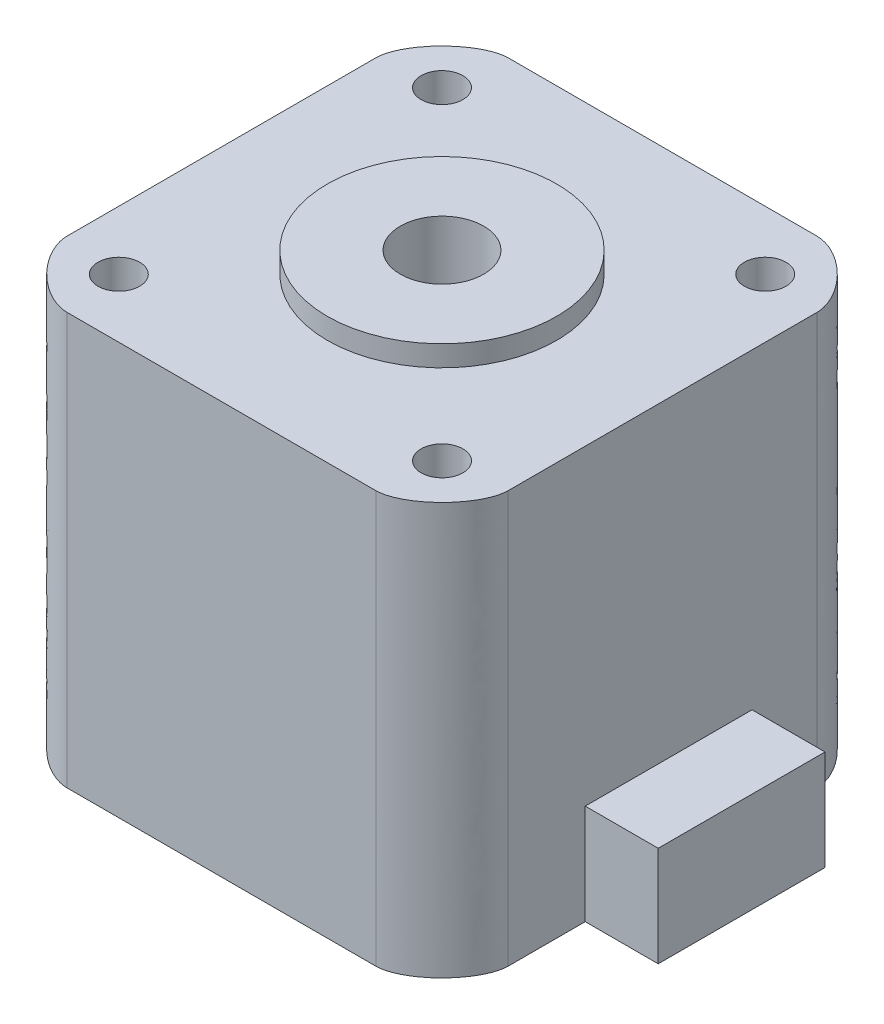
ISO-10303-21;
HEADER;
FILE_DESCRIPTION(('STEP AP214'),'2;1');
FILE_NAME('part.step','',(''),(''),'','','');
FILE_SCHEMA(('AUTOMOTIVE_DESIGN { 1 0 10303 214 1 1 1 1 }'));
ENDSEC;
DATA;
#1=APPLICATION_CONTEXT('core data for automotive mechanical design processes');
#2=APPLICATION_PROTOCOL_DEFINITION('international standard','automotive_design',2000,#1);
#3=PRODUCT_CONTEXT('',#1,'mechanical');
#4=PRODUCT('Part','Part','',(#3));
#5=PRODUCT_RELATED_PRODUCT_CATEGORY('part','',(#4));
#6=PRODUCT_DEFINITION_FORMATION('','',#4);
#7=PRODUCT_DEFINITION_CONTEXT('part definition',#1,'design');
#8=PRODUCT_DEFINITION('design','',#6,#7);
#9=PRODUCT_DEFINITION_SHAPE('','',#8);
#10=(LENGTH_UNIT() NAMED_UNIT(*) SI_UNIT(.MILLI.,.METRE.));
#11=(NAMED_UNIT(*) PLANE_ANGLE_UNIT() SI_UNIT($,.RADIAN.));
#12=(NAMED_UNIT(*) SI_UNIT($,.STERADIAN.) SOLID_ANGLE_UNIT());
#13=UNCERTAINTY_MEASURE_WITH_UNIT(LENGTH_MEASURE(1.E-05),#10,'distance_accuracy_value','');
#14=(GEOMETRIC_REPRESENTATION_CONTEXT(3) GLOBAL_UNCERTAINTY_ASSIGNED_CONTEXT((#13)) GLOBAL_UNIT_ASSIGNED_CONTEXT((#10,
#11,#12)) REPRESENTATION_CONTEXT('',''));
#15=CARTESIAN_POINT('',(0.,0.,0.));
#16=DIRECTION('',(0.,0.,1.));
#17=DIRECTION('',(1.,0.,0.));
#18=AXIS2_PLACEMENT_3D('',#15,#16,#17);
#19=CARTESIAN_POINT('',(27.5590909090909,39.5,-17.4113636363636));
#20=DIRECTION('',(-1.,0.,0.));
#21=DIRECTION('',(0.,0.,1.));
#22=AXIS2_PLACEMENT_3D('',#19,#20,#21);
#23=PLANE('',#22);
#24=DIRECTION('',(0.,-1.,0.));
#25=VECTOR('',#24,1.);
#26=CARTESIAN_POINT('',(27.5590909090909,9.6,11.1510889896497));
#27=LINE('',#26,#25);
#28=CARTESIAN_POINT('',(27.5590909090909,9.6,11.1510889896497));
#29=VERTEX_POINT('',#28);
#30=CARTESIAN_POINT('',(27.5590909090909,0.,11.1510889896497));
#31=VERTEX_POINT('',#30);
#32=EDGE_CURVE('E59',#29,#31,#27,.T.);
#33=ORIENTED_EDGE('',*,*,#32,.F.);
#34=DIRECTION('',(0.,0.,1.));
#35=VECTOR('',#34,1.);
#36=CARTESIAN_POINT('',(27.5590909090909,9.6,11.1510889896497));
#37=LINE('',#36,#35);
#38=CARTESIAN_POINT('',(27.5590909090909,9.6,-4.84891101035028));
#39=VERTEX_POINT('',#38);
#40=EDGE_CURVE('E63',#39,#29,#37,.T.);
#41=ORIENTED_EDGE('',*,*,#40,.F.);
#42=DIRECTION('',(0.,1.,0.));
#43=VECTOR('',#42,1.);
#44=CARTESIAN_POINT('',(27.5590909090909,9.6,-4.84891101035028));
#45=LINE('',#44,#43);
#46=CARTESIAN_POINT('',(27.5590909090909,0.,-4.84891101035028));
#47=VERTEX_POINT('',#46);
#48=EDGE_CURVE('E845',#47,#39,#45,.T.);
#49=ORIENTED_EDGE('',*,*,#48,.F.);
#50=DIRECTION('',(0.,0.,-1.));
#51=VECTOR('',#50,1.);
#52=CARTESIAN_POINT('',(27.5590909090909,0.,-17.4113636363636));
#53=LINE('',#52,#51);
#54=CARTESIAN_POINT('',(27.5590909090909,0.,-11.0613636363636));
#55=VERTEX_POINT('',#54);
#56=EDGE_CURVE('E46',#47,#55,#53,.T.);
#57=ORIENTED_EDGE('',*,*,#56,.T.);
#58=CARTESIAN_POINT('',(27.5590909090909,41.475,-11.0613636363636));
#59=CARTESIAN_POINT('',(27.5590909090909,26.9916666666666,-11.0613636363636));
#60=CARTESIAN_POINT('',(27.5590909090909,12.5083333333334,-11.0613636363636));
#61=CARTESIAN_POINT('',(27.5590909090909,-1.97499999999999,-11.0613636363636));
#62=(BOUNDED_CURVE() B_SPLINE_CURVE(3,(#58,#59,#60,#61),.UNSPECIFIED.,.F.,
.F.) B_SPLINE_CURVE_WITH_KNOTS((4,4),(-0.001975,0.041475),
.UNSPECIFIED.) CURVE() GEOMETRIC_REPRESENTATION_ITEM() RATIONAL_B_SPLINE_CURVE((1.,1.,1.,1.)) REPRESENTATION_ITEM(''));
#63=CARTESIAN_POINT('',(27.5590909090909,39.5,-11.0613636363636));
#64=VERTEX_POINT('',#63);
#65=EDGE_CURVE('E12',#55,#64,#62,.F.);
#66=ORIENTED_EDGE('',*,*,#65,.T.);
#67=DIRECTION('',(0.,0.,-1.));
#68=VECTOR('',#67,1.);
#69=CARTESIAN_POINT('',(27.5590909090909,39.5,-17.4113636363636));
#70=LINE('',#69,#68);
#71=CARTESIAN_POINT('',(27.5590909090909,39.5,18.5386363636363));
#72=VERTEX_POINT('',#71);
#73=EDGE_CURVE('E328',#72,#64,#70,.T.);
#74=ORIENTED_EDGE('',*,*,#73,.F.);
#75=CARTESIAN_POINT('',(27.5590909090909,-1.97499999999999,18.5386363636364));
#76=CARTESIAN_POINT('',(27.5590909090909,12.5083333333334,18.5386363636364));
#77=CARTESIAN_POINT('',(27.5590909090909,26.9916666666666,18.5386363636364));
#78=CARTESIAN_POINT('',(27.5590909090909,41.475,18.5386363636364));
#79=(BOUNDED_CURVE() B_SPLINE_CURVE(3,(#75,#76,#77,#78),.UNSPECIFIED.,.F.,
.F.) B_SPLINE_CURVE_WITH_KNOTS((4,4),(-0.001975,0.041475),
.UNSPECIFIED.) CURVE() GEOMETRIC_REPRESENTATION_ITEM() RATIONAL_B_SPLINE_CURVE((1.,1.,1.,1.)) REPRESENTATION_ITEM(''));
#80=CARTESIAN_POINT('',(27.5590909090909,0.,18.5386363636363));
#81=VERTEX_POINT('',#80);
#82=EDGE_CURVE('E52',#72,#81,#79,.F.);
#83=ORIENTED_EDGE('',*,*,#82,.T.);
#84=EDGE_CURVE('E264',#81,#31,#53,.T.);
#85=ORIENTED_EDGE('',*,*,#84,.T.);
#86=EDGE_LOOP('',(#33,#41,#49,#57,#66,#74,#83,#85));
#87=FACE_BOUND('',#86,.T.);
#88=ADVANCED_FACE('F38',(#87),#23,.F.);
#89=CARTESIAN_POINT('',(-14.7409090909091,39.5,-17.4113636363636));
#90=DIRECTION('',(1.,0.,0.));
#91=DIRECTION('',(0.,0.,-1.));
#92=AXIS2_PLACEMENT_3D('',#89,#90,#91);
#93=PLANE('',#92);
#94=DIRECTION('',(0.,0.,1.));
#95=VECTOR('',#94,1.);
#96=CARTESIAN_POINT('',(-14.7409090909091,39.5,-17.4113636363636));
#97=LINE('',#96,#95);
#98=CARTESIAN_POINT('',(-14.7409090909091,39.5,-11.0613636363636));
#99=VERTEX_POINT('',#98);
#100=CARTESIAN_POINT('',(-14.7409090909091,39.5,18.5386363636364));
#101=VERTEX_POINT('',#100);
#102=EDGE_CURVE('E215',#99,#101,#97,.T.);
#103=ORIENTED_EDGE('',*,*,#102,.F.);
#104=CARTESIAN_POINT('',(-14.7409090909091,-1.97499999999999,-11.0613636363636));
#105=CARTESIAN_POINT('',(-14.7409090909091,12.5083333333334,-11.0613636363636));
#106=CARTESIAN_POINT('',(-14.7409090909091,26.9916666666666,-11.0613636363636));
#107=CARTESIAN_POINT('',(-14.7409090909091,41.475,-11.0613636363636));
#108=(BOUNDED_CURVE() B_SPLINE_CURVE(3,(#104,#105,#106,#107),.UNSPECIFIED.,.F.,
.F.) B_SPLINE_CURVE_WITH_KNOTS((4,4),(-0.001975,0.041475),
.UNSPECIFIED.) CURVE() GEOMETRIC_REPRESENTATION_ITEM() RATIONAL_B_SPLINE_CURVE((1.,1.,1.,1.)) REPRESENTATION_ITEM(''));
#109=CARTESIAN_POINT('',(-14.7409090909091,0.,-11.0613636363636));
#110=VERTEX_POINT('',#109);
#111=EDGE_CURVE('E447',#99,#110,#108,.F.);
#112=ORIENTED_EDGE('',*,*,#111,.T.);
#113=DIRECTION('',(0.,0.,1.));
#114=VECTOR('',#113,1.);
#115=CARTESIAN_POINT('',(-14.7409090909091,0.,-17.4113636363636));
#116=LINE('',#115,#114);
#117=CARTESIAN_POINT('',(-14.7409090909091,0.,18.5386363636364));
#118=VERTEX_POINT('',#117);
#119=EDGE_CURVE('E204',#110,#118,#116,.T.);
#120=ORIENTED_EDGE('',*,*,#119,.T.);
#121=CARTESIAN_POINT('',(-14.7409090909091,41.475,18.5386363636364));
#122=CARTESIAN_POINT('',(-14.7409090909091,26.9916666666666,18.5386363636364));
#123=CARTESIAN_POINT('',(-14.7409090909091,12.5083333333334,18.5386363636364));
#124=CARTESIAN_POINT('',(-14.7409090909091,-1.97499999999999,18.5386363636364));
#125=(BOUNDED_CURVE() B_SPLINE_CURVE(3,(#121,#122,#123,#124),.UNSPECIFIED.,.F.,
.F.) B_SPLINE_CURVE_WITH_KNOTS((4,4),(-0.001975,0.041475),
.UNSPECIFIED.) CURVE() GEOMETRIC_REPRESENTATION_ITEM() RATIONAL_B_SPLINE_CURVE((1.,1.,1.,1.)) REPRESENTATION_ITEM(''));
#126=EDGE_CURVE('E208',#118,#101,#125,.F.);
#127=ORIENTED_EDGE('',*,*,#126,.T.);
#128=EDGE_LOOP('',(#103,#112,#120,#127));
#129=FACE_BOUND('',#128,.T.);
#130=ADVANCED_FACE('F234',(#129),#93,.F.);
#131=CARTESIAN_POINT('',(-14.7409090909091,39.5,24.8886363636364));
#132=DIRECTION('',(0.,0.,-1.));
#133=DIRECTION('',(-1.,0.,0.));
#134=AXIS2_PLACEMENT_3D('',#131,#132,#133);
#135=PLANE('',#134);
#136=DIRECTION('',(1.,0.,0.));
#137=VECTOR('',#136,1.);
#138=CARTESIAN_POINT('',(-14.7409090909091,39.5,24.8886363636364));
#139=LINE('',#138,#137);
#140=CARTESIAN_POINT('',(-8.39090909090907,39.5,24.8886363636364));
#141=VERTEX_POINT('',#140);
#142=CARTESIAN_POINT('',(21.2090909090909,39.5,24.8886363636364));
#143=VERTEX_POINT('',#142);
#144=EDGE_CURVE('E219',#141,#143,#139,.T.);
#145=ORIENTED_EDGE('',*,*,#144,.F.);
#146=CARTESIAN_POINT('',(-8.39090909090906,-1.97499999999999,24.8886363636364));
#147=CARTESIAN_POINT('',(-8.39090909090906,12.5083333333334,24.8886363636364));
#148=CARTESIAN_POINT('',(-8.39090909090906,26.9916666666666,24.8886363636364));
#149=CARTESIAN_POINT('',(-8.39090909090906,41.475,24.8886363636364));
#150=(BOUNDED_CURVE() B_SPLINE_CURVE(3,(#146,#147,#148,#149),.UNSPECIFIED.,.F.,
.F.) B_SPLINE_CURVE_WITH_KNOTS((4,4),(-0.001975,0.041475),
.UNSPECIFIED.) CURVE() GEOMETRIC_REPRESENTATION_ITEM() RATIONAL_B_SPLINE_CURVE((1.,1.,1.,1.)) REPRESENTATION_ITEM(''));
#151=CARTESIAN_POINT('',(-8.39090909090907,0.,24.8886363636364));
#152=VERTEX_POINT('',#151);
#153=EDGE_CURVE('E402',#141,#152,#150,.F.);
#154=ORIENTED_EDGE('',*,*,#153,.T.);
#155=DIRECTION('',(1.,0.,0.));
#156=VECTOR('',#155,1.);
#157=CARTESIAN_POINT('',(-14.7409090909091,0.,24.8886363636364));
#158=LINE('',#157,#156);
#159=CARTESIAN_POINT('',(21.2090909090909,0.,24.8886363636364));
#160=VERTEX_POINT('',#159);
#161=EDGE_CURVE('E273',#152,#160,#158,.T.);
#162=ORIENTED_EDGE('',*,*,#161,.T.);
#163=CARTESIAN_POINT('',(21.2090909090909,41.475,24.8886363636364));
#164=CARTESIAN_POINT('',(21.2090909090909,26.9916666666666,24.8886363636364));
#165=CARTESIAN_POINT('',(21.2090909090909,12.5083333333334,24.8886363636364));
#166=CARTESIAN_POINT('',(21.2090909090909,-1.97499999999999,24.8886363636364));
#167=(BOUNDED_CURVE() B_SPLINE_CURVE(3,(#163,#164,#165,#166),.UNSPECIFIED.,.F.,
.F.) B_SPLINE_CURVE_WITH_KNOTS((4,4),(-0.001975,0.041475),
.UNSPECIFIED.) CURVE() GEOMETRIC_REPRESENTATION_ITEM() RATIONAL_B_SPLINE_CURVE((1.,1.,1.,1.)) REPRESENTATION_ITEM(''));
#168=EDGE_CURVE('E390',#160,#143,#167,.F.);
#169=ORIENTED_EDGE('',*,*,#168,.T.);
#170=EDGE_LOOP('',(#145,#154,#162,#169));
#171=FACE_BOUND('',#170,.T.);
#172=ADVANCED_FACE('F244',(#171),#135,.F.);
#173=CARTESIAN_POINT('',(-14.7409090909091,39.5,-17.4113636363636));
#174=DIRECTION('',(0.,0.,1.));
#175=DIRECTION('',(1.,0.,0.));
#176=AXIS2_PLACEMENT_3D('',#173,#174,#175);
#177=PLANE('',#176);
#178=DIRECTION('',(-1.,0.,0.));
#179=VECTOR('',#178,1.);
#180=CARTESIAN_POINT('',(-14.7409090909091,0.,-17.4113636363636));
#181=LINE('',#180,#179);
#182=CARTESIAN_POINT('',(21.2090909090909,0.,-17.4113636363636));
#183=VERTEX_POINT('',#182);
#184=CARTESIAN_POINT('',(-8.39090909090907,0.,-17.4113636363636));
#185=VERTEX_POINT('',#184);
#186=EDGE_CURVE('E220',#183,#185,#181,.T.);
#187=ORIENTED_EDGE('',*,*,#186,.T.);
#188=CARTESIAN_POINT('',(-8.39090909090907,41.475,-17.4113636363636));
#189=CARTESIAN_POINT('',(-8.39090909090907,26.9916666666666,-17.4113636363636));
#190=CARTESIAN_POINT('',(-8.39090909090907,12.5083333333334,-17.4113636363636));
#191=CARTESIAN_POINT('',(-8.39090909090907,-1.97499999999999,-17.4113636363636));
#192=(BOUNDED_CURVE() B_SPLINE_CURVE(3,(#188,#189,#190,#191),.UNSPECIFIED.,.F.,
.F.) B_SPLINE_CURVE_WITH_KNOTS((4,4),(-0.001975,0.041475),
.UNSPECIFIED.) CURVE() GEOMETRIC_REPRESENTATION_ITEM() RATIONAL_B_SPLINE_CURVE((1.,1.,1.,1.)) REPRESENTATION_ITEM(''));
#193=CARTESIAN_POINT('',(-8.39090909090907,39.5,-17.4113636363636));
#194=VERTEX_POINT('',#193);
#195=EDGE_CURVE('E466',#185,#194,#192,.F.);
#196=ORIENTED_EDGE('',*,*,#195,.T.);
#197=DIRECTION('',(-1.,0.,0.));
#198=VECTOR('',#197,1.);
#199=CARTESIAN_POINT('',(-14.7409090909091,39.5,-17.4113636363636));
#200=LINE('',#199,#198);
#201=CARTESIAN_POINT('',(21.2090909090909,39.5,-17.4113636363636));
#202=VERTEX_POINT('',#201);
#203=EDGE_CURVE('E209',#202,#194,#200,.T.);
#204=ORIENTED_EDGE('',*,*,#203,.F.);
#205=CARTESIAN_POINT('',(21.2090909090909,-1.97499999999999,-17.4113636363636));
#206=CARTESIAN_POINT('',(21.2090909090909,12.5083333333334,-17.4113636363636));
#207=CARTESIAN_POINT('',(21.2090909090909,26.9916666666666,-17.4113636363636));
#208=CARTESIAN_POINT('',(21.2090909090909,41.475,-17.4113636363636));
#209=(BOUNDED_CURVE() B_SPLINE_CURVE(3,(#205,#206,#207,#208),.UNSPECIFIED.,.F.,
.F.) B_SPLINE_CURVE_WITH_KNOTS((4,4),(-0.001975,0.041475),
.UNSPECIFIED.) CURVE() GEOMETRIC_REPRESENTATION_ITEM() RATIONAL_B_SPLINE_CURVE((1.,1.,1.,1.)) REPRESENTATION_ITEM(''));
#210=EDGE_CURVE('E543',#202,#183,#209,.F.);
#211=ORIENTED_EDGE('',*,*,#210,.T.);
#212=EDGE_LOOP('',(#187,#196,#204,#211));
#213=FACE_BOUND('',#212,.T.);
#214=ADVANCED_FACE('F298',(#213),#177,.F.);
#215=CARTESIAN_POINT('',(0.,39.5,0.));
#216=DIRECTION('',(0.,1.,0.));
#217=DIRECTION('',(0.,0.,1.));
#218=AXIS2_PLACEMENT_3D('',#215,#216,#217);
#219=PLANE('',#218);
#220=CARTESIAN_POINT('',(-9.09211100619109,39.5,-11.761363589784));
#221=DIRECTION('',(0.,1.,0.));
#222=DIRECTION('',(0.,0.,1.));
#223=AXIS2_PLACEMENT_3D('',#220,#221,#222);
#224=CIRCLE('',#223,2.);
#225=CARTESIAN_POINT('',(-9.09211100619109,39.5,-9.76136358978397));
#226=VERTEX_POINT('',#225);
#227=EDGE_CURVE('E176',#226,#226,#224,.T.);
#228=ORIENTED_EDGE('',*,*,#227,.F.);
#229=EDGE_LOOP('',(#228));
#230=FACE_BOUND('',#229,.T.);
#231=CARTESIAN_POINT('',(21.9078889938089,39.5,-11.761363589784));
#232=DIRECTION('',(0.,1.,0.));
#233=DIRECTION('',(0.,0.,1.));
#234=AXIS2_PLACEMENT_3D('',#231,#232,#233);
#235=CIRCLE('',#234,2.);
#236=CARTESIAN_POINT('',(21.9078889938089,39.5,-9.76136358978397));
#237=VERTEX_POINT('',#236);
#238=EDGE_CURVE('E183',#237,#237,#235,.T.);
#239=ORIENTED_EDGE('',*,*,#238,.F.);
#240=EDGE_LOOP('',(#239));
#241=FACE_BOUND('',#240,.T.);
#242=CARTESIAN_POINT('',(21.9102928243682,39.5,19.238636317016));
#243=DIRECTION('',(0.,1.,0.));
#244=DIRECTION('',(0.,0.,1.));
#245=AXIS2_PLACEMENT_3D('',#242,#243,#244);
#246=CIRCLE('',#245,2.);
#247=CARTESIAN_POINT('',(21.9102928243682,39.5,21.238636317016));
#248=VERTEX_POINT('',#247);
#249=EDGE_CURVE('E189',#248,#248,#246,.T.);
#250=ORIENTED_EDGE('',*,*,#249,.F.);
#251=EDGE_LOOP('',(#250));
#252=FACE_BOUND('',#251,.T.);
#253=CARTESIAN_POINT('',(-9.08970717563177,39.5,19.238636410216));
#254=DIRECTION('',(0.,1.,0.));
#255=DIRECTION('',(0.,0.,1.));
#256=AXIS2_PLACEMENT_3D('',#253,#254,#255);
#257=CIRCLE('',#256,2.);
#258=CARTESIAN_POINT('',(-9.08970717563177,39.5,21.238636410216));
#259=VERTEX_POINT('',#258);
#260=EDGE_CURVE('E195',#259,#259,#257,.T.);
#261=ORIENTED_EDGE('',*,*,#260,.F.);
#262=EDGE_LOOP('',(#261));
#263=FACE_BOUND('',#262,.T.);
#264=CARTESIAN_POINT('',(6.40909090909093,39.5,3.73863636363637));
#265=DIRECTION('',(0.,1.,0.));
#266=DIRECTION('',(0.,0.,1.));
#267=AXIS2_PLACEMENT_3D('',#264,#265,#266);
#268=CIRCLE('',#267,11.);
#269=CARTESIAN_POINT('',(6.40909090909093,39.5,14.7386363636364));
#270=VERTEX_POINT('',#269);
#271=EDGE_CURVE('E205',#270,#270,#268,.T.);
#272=ORIENTED_EDGE('',*,*,#271,.F.);
#273=EDGE_LOOP('',(#272));
#274=FACE_BOUND('',#273,.T.);
#275=ORIENTED_EDGE('',*,*,#203,.T.);
#276=CARTESIAN_POINT('',(-14.7409090909091,39.5,-11.0613636363636));
#277=CARTESIAN_POINT('',(-14.7409090909091,39.5,-17.4113636363636));
#278=CARTESIAN_POINT('',(-8.39090909090907,39.5,-17.4113636363636));
#279=(BOUNDED_CURVE() B_SPLINE_CURVE(2,(#276,#277,#278),.UNSPECIFIED.,.F.,
.F.) B_SPLINE_CURVE_WITH_KNOTS((3,3),(0.,1.),
.UNSPECIFIED.) CURVE() GEOMETRIC_REPRESENTATION_ITEM() RATIONAL_B_SPLINE_CURVE((1.,
0.449012806053458,1.)) REPRESENTATION_ITEM(''));
#280=EDGE_CURVE('E378',#194,#99,#279,.F.);
#281=ORIENTED_EDGE('',*,*,#280,.T.);
#282=ORIENTED_EDGE('',*,*,#102,.T.);
#283=CARTESIAN_POINT('',(-8.39090909090906,39.5,24.8886363636364));
#284=CARTESIAN_POINT('',(-14.7409090909091,39.5,24.8886363636364));
#285=CARTESIAN_POINT('',(-14.7409090909091,39.5,18.5386363636364));
#286=(BOUNDED_CURVE() B_SPLINE_CURVE(2,(#283,#284,#285),.UNSPECIFIED.,.F.,
.F.) B_SPLINE_CURVE_WITH_KNOTS((3,3),(0.,1.),
.UNSPECIFIED.) CURVE() GEOMETRIC_REPRESENTATION_ITEM() RATIONAL_B_SPLINE_CURVE((1.,
0.449012806053458,1.)) REPRESENTATION_ITEM(''));
#287=EDGE_CURVE('E366',#101,#141,#286,.F.);
#288=ORIENTED_EDGE('',*,*,#287,.T.);
#289=ORIENTED_EDGE('',*,*,#144,.T.);
#290=CARTESIAN_POINT('',(27.5590909090909,39.5,18.5386363636364));
#291=CARTESIAN_POINT('',(27.5590909090909,39.5,24.8886363636364));
#292=CARTESIAN_POINT('',(21.2090909090909,39.5,24.8886363636364));
#293=(BOUNDED_CURVE() B_SPLINE_CURVE(2,(#290,#291,#292),.UNSPECIFIED.,.F.,
.F.) B_SPLINE_CURVE_WITH_KNOTS((3,3),(0.,1.),
.UNSPECIFIED.) CURVE() GEOMETRIC_REPRESENTATION_ITEM() RATIONAL_B_SPLINE_CURVE((1.,
0.449012806053458,1.)) REPRESENTATION_ITEM(''));
#294=EDGE_CURVE('E342',#143,#72,#293,.F.);
#295=ORIENTED_EDGE('',*,*,#294,.T.);
#296=ORIENTED_EDGE('',*,*,#73,.T.);
#297=CARTESIAN_POINT('',(21.2090909090909,39.5,-17.4113636363636));
#298=CARTESIAN_POINT('',(27.5590909090909,39.5,-17.4113636363636));
#299=CARTESIAN_POINT('',(27.5590909090909,39.5,-11.0613636363636));
#300=(BOUNDED_CURVE() B_SPLINE_CURVE(2,(#297,#298,#299),.UNSPECIFIED.,.F.,
.F.) B_SPLINE_CURVE_WITH_KNOTS((3,3),(0.,1.),
.UNSPECIFIED.) CURVE() GEOMETRIC_REPRESENTATION_ITEM() RATIONAL_B_SPLINE_CURVE((1.,
0.449012806053458,1.)) REPRESENTATION_ITEM(''));
#301=EDGE_CURVE('E354',#64,#202,#300,.F.);
#302=ORIENTED_EDGE('',*,*,#301,.T.);
#303=EDGE_LOOP('',(#275,#281,#282,#288,#289,#295,#296,#302));
#304=FACE_BOUND('',#303,.T.);
#305=ADVANCED_FACE('F295',(#230,#241,#252,#263,#274,#304),#219,.T.);
#306=CARTESIAN_POINT('',(0.,0.,0.));
#307=DIRECTION('',(0.,1.,0.));
#308=DIRECTION('',(0.,0.,1.));
#309=AXIS2_PLACEMENT_3D('',#306,#307,#308);
#310=PLANE('',#309);
#311=ORIENTED_EDGE('',*,*,#119,.F.);
#312=CARTESIAN_POINT('',(-8.39090909090907,0.,-17.4113636363636));
#313=CARTESIAN_POINT('',(-14.7409090909091,0.,-17.4113636363636));
#314=CARTESIAN_POINT('',(-14.7409090909091,0.,-11.0613636363636));
#315=(BOUNDED_CURVE() B_SPLINE_CURVE(2,(#312,#313,#314),.UNSPECIFIED.,.F.,
.F.) B_SPLINE_CURVE_WITH_KNOTS((3,3),(0.,1.),
.UNSPECIFIED.) CURVE() GEOMETRIC_REPRESENTATION_ITEM() RATIONAL_B_SPLINE_CURVE((1.,
0.449012806053458,1.)) REPRESENTATION_ITEM(''));
#316=EDGE_CURVE('E317',#110,#185,#315,.F.);
#317=ORIENTED_EDGE('',*,*,#316,.T.);
#318=ORIENTED_EDGE('',*,*,#186,.F.);
#319=CARTESIAN_POINT('',(27.5590909090909,0.,-11.0613636363636));
#320=CARTESIAN_POINT('',(27.5590909090909,0.,-17.4113636363636));
#321=CARTESIAN_POINT('',(21.2090909090909,0.,-17.4113636363636));
#322=(BOUNDED_CURVE() B_SPLINE_CURVE(2,(#319,#320,#321),.UNSPECIFIED.,.F.,
.F.) B_SPLINE_CURVE_WITH_KNOTS((3,3),(0.,1.),
.UNSPECIFIED.) CURVE() GEOMETRIC_REPRESENTATION_ITEM() RATIONAL_B_SPLINE_CURVE((1.,
0.449012806053458,1.)) REPRESENTATION_ITEM(''));
#323=EDGE_CURVE('E533',#183,#55,#322,.F.);
#324=ORIENTED_EDGE('',*,*,#323,.T.);
#325=ORIENTED_EDGE('',*,*,#56,.F.);
#326=DIRECTION('',(-1.,0.,0.));
#327=VECTOR('',#326,1.);
#328=CARTESIAN_POINT('',(34.5590909090909,0.,-4.84891101035028));
#329=LINE('',#328,#327);
#330=CARTESIAN_POINT('',(34.5590909090909,0.,-4.84891101035028));
#331=VERTEX_POINT('',#330);
#332=EDGE_CURVE('E151',#331,#47,#329,.T.);
#333=ORIENTED_EDGE('',*,*,#332,.F.);
#334=DIRECTION('',(0.,0.,-1.));
#335=VECTOR('',#334,1.);
#336=CARTESIAN_POINT('',(34.5590909090909,0.,11.1510889896497));
#337=LINE('',#336,#335);
#338=CARTESIAN_POINT('',(34.5590909090909,0.,11.1510889896497));
#339=VERTEX_POINT('',#338);
#340=EDGE_CURVE('E143',#339,#331,#337,.T.);
#341=ORIENTED_EDGE('',*,*,#340,.F.);
#342=DIRECTION('',(-1.,0.,0.));
#343=VECTOR('',#342,1.);
#344=CARTESIAN_POINT('',(34.5590909090909,0.,11.1510889896497));
#345=LINE('',#344,#343);
#346=EDGE_CURVE('E149',#339,#31,#345,.T.);
#347=ORIENTED_EDGE('',*,*,#346,.T.);
#348=ORIENTED_EDGE('',*,*,#84,.F.);
#349=CARTESIAN_POINT('',(21.2090909090909,0.,24.8886363636364));
#350=CARTESIAN_POINT('',(27.5590909090909,0.,24.8886363636364));
#351=CARTESIAN_POINT('',(27.5590909090909,0.,18.5386363636364));
#352=(BOUNDED_CURVE() B_SPLINE_CURVE(2,(#349,#350,#351),.UNSPECIFIED.,.F.,
.F.) B_SPLINE_CURVE_WITH_KNOTS((3,3),(0.,1.),
.UNSPECIFIED.) CURVE() GEOMETRIC_REPRESENTATION_ITEM() RATIONAL_B_SPLINE_CURVE((1.,
0.449012806053458,1.)) REPRESENTATION_ITEM(''));
#353=EDGE_CURVE('E278',#81,#160,#352,.F.);
#354=ORIENTED_EDGE('',*,*,#353,.T.);
#355=ORIENTED_EDGE('',*,*,#161,.F.);
#356=CARTESIAN_POINT('',(-14.7409090909091,0.,18.5386363636364));
#357=CARTESIAN_POINT('',(-14.7409090909091,0.,24.8886363636364));
#358=CARTESIAN_POINT('',(-8.39090909090906,0.,24.8886363636364));
#359=(BOUNDED_CURVE() B_SPLINE_CURVE(2,(#356,#357,#358),.UNSPECIFIED.,.F.,
.F.) B_SPLINE_CURVE_WITH_KNOTS((3,3),(0.,1.),
.UNSPECIFIED.) CURVE() GEOMETRIC_REPRESENTATION_ITEM() RATIONAL_B_SPLINE_CURVE((1.,
0.449012806053458,1.)) REPRESENTATION_ITEM(''));
#360=EDGE_CURVE('E477',#152,#118,#359,.F.);
#361=ORIENTED_EDGE('',*,*,#360,.T.);
#362=EDGE_LOOP('',(#311,#317,#318,#324,#325,#333,#341,#347,#348,#354,#355,#361));
#363=FACE_BOUND('',#362,.T.);
#364=ADVANCED_FACE('F146',(#363),#310,.F.);
#365=CARTESIAN_POINT('',(6.40909090909093,41.5,3.73863636363637));
#366=DIRECTION('',(0.,-1.,0.));
#367=DIRECTION('',(0.,0.,-1.));
#368=AXIS2_PLACEMENT_3D('',#365,#366,#367);
#369=CYLINDRICAL_SURFACE('',#368,11.);
#370=CARTESIAN_POINT('',(6.40909090909093,41.5,3.73863636363637));
#371=DIRECTION('',(0.,1.,0.));
#372=DIRECTION('',(0.,0.,1.));
#373=AXIS2_PLACEMENT_3D('',#370,#371,#372);
#374=CIRCLE('',#373,11.);
#375=CARTESIAN_POINT('',(6.40909090909093,41.5,14.7386363636364));
#376=VERTEX_POINT('',#375);
#377=EDGE_CURVE('E201',#376,#376,#374,.T.);
#378=ORIENTED_EDGE('',*,*,#377,.F.);
#379=EDGE_LOOP('',(#378));
#380=FACE_BOUND('',#379,.T.);
#381=ORIENTED_EDGE('',*,*,#271,.T.);
#382=EDGE_LOOP('',(#381));
#383=FACE_BOUND('',#382,.T.);
#384=ADVANCED_FACE('F294',(#380,#383),#369,.T.);
#385=CARTESIAN_POINT('',(6.40909090909093,41.5,3.73863636363637));
#386=DIRECTION('',(0.,1.,0.));
#387=DIRECTION('',(0.,0.,1.));
#388=AXIS2_PLACEMENT_3D('',#385,#386,#387);
#389=PLANE('',#388);
#390=CARTESIAN_POINT('',(6.40909090909093,41.5,3.73863636363637));
#391=DIRECTION('',(0.,1.,0.));
#392=DIRECTION('',(0.,0.,1.));
#393=AXIS2_PLACEMENT_3D('',#390,#391,#392);
#394=CIRCLE('',#393,4.);
#395=CARTESIAN_POINT('',(6.40909090909093,41.5,7.73863636363638));
#396=VERTEX_POINT('',#395);
#397=EDGE_CURVE('E166',#396,#396,#394,.T.);
#398=ORIENTED_EDGE('',*,*,#397,.F.);
#399=EDGE_LOOP('',(#398));
#400=FACE_BOUND('',#399,.T.);
#401=ORIENTED_EDGE('',*,*,#377,.T.);
#402=EDGE_LOOP('',(#401));
#403=FACE_BOUND('',#402,.T.);
#404=ADVANCED_FACE('F623',(#400,#403),#389,.T.);
#405=CARTESIAN_POINT('',(-14.7409090909091,41.475,-11.0613636363636));
#406=CARTESIAN_POINT('',(-14.7409090909091,26.9916666666666,-11.0613636363636));
#407=CARTESIAN_POINT('',(-14.7409090909091,12.5083333333334,-11.0613636363636));
#408=CARTESIAN_POINT('',(-14.7409090909091,-1.97499999999999,-11.0613636363636));
#409=CARTESIAN_POINT('',(-14.7409090909091,41.475,-17.4113636363636));
#410=CARTESIAN_POINT('',(-14.7409090909091,26.9916666666666,-17.4113636363636));
#411=CARTESIAN_POINT('',(-14.7409090909091,12.5083333333334,-17.4113636363636));
#412=CARTESIAN_POINT('',(-14.7409090909091,-1.97499999999999,-17.4113636363636));
#413=CARTESIAN_POINT('',(-8.39090909090907,41.475,-17.4113636363636));
#414=CARTESIAN_POINT('',(-8.39090909090907,26.9916666666666,-17.4113636363636));
#415=CARTESIAN_POINT('',(-8.39090909090907,12.5083333333334,-17.4113636363636));
#416=CARTESIAN_POINT('',(-8.39090909090907,-1.97499999999999,-17.4113636363636));
#417=(BOUNDED_SURFACE() B_SPLINE_SURFACE(2,3,((#405,#406,#407,#408),(#409,#410,#411,#412),(#413,
#414,#415,#416)),.UNSPECIFIED.,.F.,.F.,.F.) B_SPLINE_SURFACE_WITH_KNOTS((3,3),(4,4),(0.,1.),
(-0.001975,0.041475),
.UNSPECIFIED.) GEOMETRIC_REPRESENTATION_ITEM() RATIONAL_B_SPLINE_SURFACE(((1.,1.,1.,1.),
(0.449012806053458,0.449012806053458,0.449012806053458,0.449012806053458),(1.,1.,1.,1.))) REPRESENTATION_ITEM('') SURFACE());
#418=ORIENTED_EDGE('',*,*,#280,.F.);
#419=ORIENTED_EDGE('',*,*,#195,.F.);
#420=ORIENTED_EDGE('',*,*,#316,.F.);
#421=ORIENTED_EDGE('',*,*,#111,.F.);
#422=EDGE_LOOP('',(#418,#419,#420,#421));
#423=FACE_BOUND('',#422,.T.);
#424=ADVANCED_FACE('F248',(#423),#417,.T.);
#425=CARTESIAN_POINT('',(-8.39090909090906,41.475,24.8886363636364));
#426=CARTESIAN_POINT('',(-8.39090909090906,26.9916666666666,24.8886363636364));
#427=CARTESIAN_POINT('',(-8.39090909090906,12.5083333333334,24.8886363636364));
#428=CARTESIAN_POINT('',(-8.39090909090906,-1.97499999999999,24.8886363636364));
#429=CARTESIAN_POINT('',(-14.7409090909091,41.475,24.8886363636364));
#430=CARTESIAN_POINT('',(-14.7409090909091,26.9916666666666,24.8886363636364));
#431=CARTESIAN_POINT('',(-14.7409090909091,12.5083333333334,24.8886363636364));
#432=CARTESIAN_POINT('',(-14.7409090909091,-1.97499999999999,24.8886363636364));
#433=CARTESIAN_POINT('',(-14.7409090909091,41.475,18.5386363636364));
#434=CARTESIAN_POINT('',(-14.7409090909091,26.9916666666666,18.5386363636364));
#435=CARTESIAN_POINT('',(-14.7409090909091,12.5083333333334,18.5386363636364));
#436=CARTESIAN_POINT('',(-14.7409090909091,-1.97499999999999,18.5386363636364));
#437=(BOUNDED_SURFACE() B_SPLINE_SURFACE(2,3,((#425,#426,#427,#428),(#429,#430,#431,#432),(#433,
#434,#435,#436)),.UNSPECIFIED.,.F.,.F.,.F.) B_SPLINE_SURFACE_WITH_KNOTS((3,3),(4,4),(0.,1.),
(-0.001975,0.041475),
.UNSPECIFIED.) GEOMETRIC_REPRESENTATION_ITEM() RATIONAL_B_SPLINE_SURFACE(((1.,1.,1.,1.),
(0.449012806053458,0.449012806053458,0.449012806053458,0.449012806053458),(1.,1.,1.,1.))) REPRESENTATION_ITEM('') SURFACE());
#438=ORIENTED_EDGE('',*,*,#287,.F.);
#439=ORIENTED_EDGE('',*,*,#126,.F.);
#440=ORIENTED_EDGE('',*,*,#360,.F.);
#441=ORIENTED_EDGE('',*,*,#153,.F.);
#442=EDGE_LOOP('',(#438,#439,#440,#441));
#443=FACE_BOUND('',#442,.T.);
#444=ADVANCED_FACE('F483',(#443),#437,.T.);
#445=CARTESIAN_POINT('',(21.2090909090909,41.475,-17.4113636363636));
#446=CARTESIAN_POINT('',(21.2090909090909,26.9916666666666,-17.4113636363636));
#447=CARTESIAN_POINT('',(21.2090909090909,12.5083333333334,-17.4113636363636));
#448=CARTESIAN_POINT('',(21.2090909090909,-1.97499999999999,-17.4113636363636));
#449=CARTESIAN_POINT('',(27.5590909090909,41.475,-17.4113636363636));
#450=CARTESIAN_POINT('',(27.5590909090909,26.9916666666666,-17.4113636363636));
#451=CARTESIAN_POINT('',(27.5590909090909,12.5083333333334,-17.4113636363636));
#452=CARTESIAN_POINT('',(27.5590909090909,-1.97499999999999,-17.4113636363636));
#453=CARTESIAN_POINT('',(27.5590909090909,41.475,-11.0613636363636));
#454=CARTESIAN_POINT('',(27.5590909090909,26.9916666666666,-11.0613636363636));
#455=CARTESIAN_POINT('',(27.5590909090909,12.5083333333334,-11.0613636363636));
#456=CARTESIAN_POINT('',(27.5590909090909,-1.97499999999999,-11.0613636363636));
#457=(BOUNDED_SURFACE() B_SPLINE_SURFACE(2,3,((#445,#446,#447,#448),(#449,#450,#451,#452),(#453,
#454,#455,#456)),.UNSPECIFIED.,.F.,.F.,.F.) B_SPLINE_SURFACE_WITH_KNOTS((3,3),(4,4),(0.,1.),
(-0.001975,0.041475),
.UNSPECIFIED.) GEOMETRIC_REPRESENTATION_ITEM() RATIONAL_B_SPLINE_SURFACE(((1.,1.,1.,1.),
(0.449012806053458,0.449012806053458,0.449012806053458,0.449012806053458),(1.,1.,1.,1.))) REPRESENTATION_ITEM('') SURFACE());
#458=ORIENTED_EDGE('',*,*,#301,.F.);
#459=ORIENTED_EDGE('',*,*,#65,.F.);
#460=ORIENTED_EDGE('',*,*,#323,.F.);
#461=ORIENTED_EDGE('',*,*,#210,.F.);
#462=EDGE_LOOP('',(#458,#459,#460,#461));
#463=FACE_BOUND('',#462,.T.);
#464=ADVANCED_FACE('F496',(#463),#457,.T.);
#465=CARTESIAN_POINT('',(27.5590909090909,41.475,18.5386363636364));
#466=CARTESIAN_POINT('',(27.5590909090909,26.9916666666666,18.5386363636364));
#467=CARTESIAN_POINT('',(27.5590909090909,12.5083333333334,18.5386363636364));
#468=CARTESIAN_POINT('',(27.5590909090909,-1.97499999999999,18.5386363636364));
#469=CARTESIAN_POINT('',(27.5590909090909,41.475,24.8886363636364));
#470=CARTESIAN_POINT('',(27.5590909090909,26.9916666666666,24.8886363636364));
#471=CARTESIAN_POINT('',(27.5590909090909,12.5083333333334,24.8886363636364));
#472=CARTESIAN_POINT('',(27.5590909090909,-1.97499999999999,24.8886363636364));
#473=CARTESIAN_POINT('',(21.2090909090909,41.475,24.8886363636364));
#474=CARTESIAN_POINT('',(21.2090909090909,26.9916666666666,24.8886363636364));
#475=CARTESIAN_POINT('',(21.2090909090909,12.5083333333334,24.8886363636364));
#476=CARTESIAN_POINT('',(21.2090909090909,-1.97499999999999,24.8886363636364));
#477=(BOUNDED_SURFACE() B_SPLINE_SURFACE(2,3,((#465,#466,#467,#468),(#469,#470,#471,#472),(#473,
#474,#475,#476)),.UNSPECIFIED.,.F.,.F.,.F.) B_SPLINE_SURFACE_WITH_KNOTS((3,3),(4,4),(0.,1.),
(-0.001975,0.041475),
.UNSPECIFIED.) GEOMETRIC_REPRESENTATION_ITEM() RATIONAL_B_SPLINE_SURFACE(((1.,1.,1.,1.),
(0.449012806053458,0.449012806053458,0.449012806053458,0.449012806053458),(1.,1.,1.,1.))) REPRESENTATION_ITEM('') SURFACE());
#478=ORIENTED_EDGE('',*,*,#294,.F.);
#479=ORIENTED_EDGE('',*,*,#168,.F.);
#480=ORIENTED_EDGE('',*,*,#353,.F.);
#481=ORIENTED_EDGE('',*,*,#82,.F.);
#482=EDGE_LOOP('',(#478,#479,#480,#481));
#483=FACE_BOUND('',#482,.T.);
#484=ADVANCED_FACE('F41',(#483),#477,.T.);
#485=CARTESIAN_POINT('',(-9.08970717563177,34.928,19.238636410216));
#486=DIRECTION('',(0.,1.,0.));
#487=DIRECTION('',(0.,0.,1.));
#488=AXIS2_PLACEMENT_3D('',#485,#486,#487);
#489=CONICAL_SURFACE('',#488,2.,1.02974425867665);
#490=CARTESIAN_POINT('',(-9.08970717563178,33.7262787619449,19.238636410216));
#491=VERTEX_POINT('',#490);
#492=VERTEX_LOOP('',#491);
#493=FACE_BOUND('',#492,.T.);
#494=CARTESIAN_POINT('',(-9.08970717563177,34.928,19.238636410216));
#495=DIRECTION('',(0.,1.,0.));
#496=DIRECTION('',(0.,0.,1.));
#497=AXIS2_PLACEMENT_3D('',#494,#495,#496);
#498=CIRCLE('',#497,2.);
#499=CARTESIAN_POINT('',(-9.08970717563177,34.928,21.238636410216));
#500=VERTEX_POINT('',#499);
#501=EDGE_CURVE('E198',#500,#500,#498,.T.);
#502=ORIENTED_EDGE('',*,*,#501,.T.);
#503=EDGE_LOOP('',(#502));
#504=FACE_BOUND('',#503,.T.);
#505=ADVANCED_FACE('F633',(#493,#504),#489,.F.);
#506=CARTESIAN_POINT('',(-9.08970717563177,39.5,19.238636410216));
#507=DIRECTION('',(0.,1.,0.));
#508=DIRECTION('',(0.,0.,1.));
#509=AXIS2_PLACEMENT_3D('',#506,#507,#508);
#510=CYLINDRICAL_SURFACE('',#509,2.);
#511=ORIENTED_EDGE('',*,*,#501,.F.);
#512=EDGE_LOOP('',(#511));
#513=FACE_BOUND('',#512,.T.);
#514=ORIENTED_EDGE('',*,*,#260,.T.);
#515=EDGE_LOOP('',(#514));
#516=FACE_BOUND('',#515,.T.);
#517=ADVANCED_FACE('F636',(#513,#516),#510,.F.);
#518=CARTESIAN_POINT('',(21.9102928243682,34.928,19.238636317016));
#519=DIRECTION('',(0.,1.,0.));
#520=DIRECTION('',(0.,0.,1.));
#521=AXIS2_PLACEMENT_3D('',#518,#519,#520);
#522=CONICAL_SURFACE('',#521,2.,1.02974425867665);
#523=CARTESIAN_POINT('',(21.9102928243682,33.7262787619449,19.238636317016));
#524=VERTEX_POINT('',#523);
#525=VERTEX_LOOP('',#524);
#526=FACE_BOUND('',#525,.T.);
#527=CARTESIAN_POINT('',(21.9102928243682,34.928,19.238636317016));
#528=DIRECTION('',(0.,1.,0.));
#529=DIRECTION('',(0.,0.,1.));
#530=AXIS2_PLACEMENT_3D('',#527,#528,#529);
#531=CIRCLE('',#530,2.);
#532=CARTESIAN_POINT('',(21.9102928243682,34.928,21.238636317016));
#533=VERTEX_POINT('',#532);
#534=EDGE_CURVE('E192',#533,#533,#531,.T.);
#535=ORIENTED_EDGE('',*,*,#534,.T.);
#536=EDGE_LOOP('',(#535));
#537=FACE_BOUND('',#536,.T.);
#538=ADVANCED_FACE('F640',(#526,#537),#522,.F.);
#539=CARTESIAN_POINT('',(21.9102928243682,39.5,19.238636317016));
#540=DIRECTION('',(0.,1.,0.));
#541=DIRECTION('',(0.,0.,1.));
#542=AXIS2_PLACEMENT_3D('',#539,#540,#541);
#543=CYLINDRICAL_SURFACE('',#542,2.);
#544=ORIENTED_EDGE('',*,*,#534,.F.);
#545=EDGE_LOOP('',(#544));
#546=FACE_BOUND('',#545,.T.);
#547=ORIENTED_EDGE('',*,*,#249,.T.);
#548=EDGE_LOOP('',(#547));
#549=FACE_BOUND('',#548,.T.);
#550=ADVANCED_FACE('F644',(#546,#549),#543,.F.);
#551=CARTESIAN_POINT('',(21.9078889938089,34.928,-11.761363589784));
#552=DIRECTION('',(0.,1.,0.));
#553=DIRECTION('',(0.,0.,1.));
#554=AXIS2_PLACEMENT_3D('',#551,#552,#553);
#555=CONICAL_SURFACE('',#554,2.,1.02974425867665);
#556=CARTESIAN_POINT('',(21.9078889938089,33.7262787619449,-11.761363589784));
#557=VERTEX_POINT('',#556);
#558=VERTEX_LOOP('',#557);
#559=FACE_BOUND('',#558,.T.);
#560=CARTESIAN_POINT('',(21.9078889938089,34.928,-11.761363589784));
#561=DIRECTION('',(0.,1.,0.));
#562=DIRECTION('',(0.,0.,1.));
#563=AXIS2_PLACEMENT_3D('',#560,#561,#562);
#564=CIRCLE('',#563,2.);
#565=CARTESIAN_POINT('',(21.9078889938089,34.928,-9.76136358978397));
#566=VERTEX_POINT('',#565);
#567=EDGE_CURVE('E186',#566,#566,#564,.T.);
#568=ORIENTED_EDGE('',*,*,#567,.T.);
#569=EDGE_LOOP('',(#568));
#570=FACE_BOUND('',#569,.T.);
#571=ADVANCED_FACE('F648',(#559,#570),#555,.F.);
#572=CARTESIAN_POINT('',(21.9078889938089,39.5,-11.761363589784));
#573=DIRECTION('',(0.,1.,0.));
#574=DIRECTION('',(0.,0.,1.));
#575=AXIS2_PLACEMENT_3D('',#572,#573,#574);
#576=CYLINDRICAL_SURFACE('',#575,2.);
#577=ORIENTED_EDGE('',*,*,#567,.F.);
#578=EDGE_LOOP('',(#577));
#579=FACE_BOUND('',#578,.T.);
#580=ORIENTED_EDGE('',*,*,#238,.T.);
#581=EDGE_LOOP('',(#580));
#582=FACE_BOUND('',#581,.T.);
#583=ADVANCED_FACE('F652',(#579,#582),#576,.F.);
#584=CARTESIAN_POINT('',(-9.09211100619109,34.928,-11.761363589784));
#585=DIRECTION('',(0.,1.,0.));
#586=DIRECTION('',(0.,0.,1.));
#587=AXIS2_PLACEMENT_3D('',#584,#585,#586);
#588=CONICAL_SURFACE('',#587,2.,1.02974425867665);
#589=CARTESIAN_POINT('',(-9.09211100619109,33.7262787619449,-11.761363589784));
#590=VERTEX_POINT('',#589);
#591=VERTEX_LOOP('',#590);
#592=FACE_BOUND('',#591,.T.);
#593=CARTESIAN_POINT('',(-9.09211100619109,34.928,-11.761363589784));
#594=DIRECTION('',(0.,1.,0.));
#595=DIRECTION('',(0.,0.,1.));
#596=AXIS2_PLACEMENT_3D('',#593,#594,#595);
#597=CIRCLE('',#596,2.);
#598=CARTESIAN_POINT('',(-9.09211100619109,34.928,-9.76136358978397));
#599=VERTEX_POINT('',#598);
#600=EDGE_CURVE('E180',#599,#599,#597,.T.);
#601=ORIENTED_EDGE('',*,*,#600,.T.);
#602=EDGE_LOOP('',(#601));
#603=FACE_BOUND('',#602,.T.);
#604=ADVANCED_FACE('F656',(#592,#603),#588,.F.);
#605=CARTESIAN_POINT('',(-9.09211100619109,39.5,-11.761363589784));
#606=DIRECTION('',(0.,1.,0.));
#607=DIRECTION('',(0.,0.,1.));
#608=AXIS2_PLACEMENT_3D('',#605,#606,#607);
#609=CYLINDRICAL_SURFACE('',#608,2.);
#610=ORIENTED_EDGE('',*,*,#600,.F.);
#611=EDGE_LOOP('',(#610));
#612=FACE_BOUND('',#611,.T.);
#613=ORIENTED_EDGE('',*,*,#227,.T.);
#614=EDGE_LOOP('',(#613));
#615=FACE_BOUND('',#614,.T.);
#616=ADVANCED_FACE('F660',(#612,#615),#609,.F.);
#617=CARTESIAN_POINT('',(6.40909090909093,4.5,3.73863636363637));
#618=DIRECTION('',(0.,1.,0.));
#619=DIRECTION('',(0.,0.,1.));
#620=AXIS2_PLACEMENT_3D('',#617,#618,#619);
#621=CYLINDRICAL_SURFACE('',#620,4.);
#622=CARTESIAN_POINT('',(6.40909090909093,4.5,3.73863636363637));
#623=DIRECTION('',(0.,1.,0.));
#624=DIRECTION('',(0.,0.,1.));
#625=AXIS2_PLACEMENT_3D('',#622,#623,#624);
#626=CIRCLE('',#625,4.);
#627=CARTESIAN_POINT('',(6.40909090909093,4.5,7.73863636363638));
#628=VERTEX_POINT('',#627);
#629=EDGE_CURVE('E169',#628,#628,#626,.T.);
#630=ORIENTED_EDGE('',*,*,#629,.F.);
#631=EDGE_LOOP('',(#630));
#632=FACE_BOUND('',#631,.T.);
#633=ORIENTED_EDGE('',*,*,#397,.T.);
#634=EDGE_LOOP('',(#633));
#635=FACE_BOUND('',#634,.T.);
#636=ADVANCED_FACE('F664',(#632,#635),#621,.F.);
#637=CARTESIAN_POINT('',(6.40909090909093,4.5,3.73863636363637));
#638=DIRECTION('',(0.,1.,0.));
#639=DIRECTION('',(0.,0.,1.));
#640=AXIS2_PLACEMENT_3D('',#637,#638,#639);
#641=PLANE('',#640);
#642=ORIENTED_EDGE('',*,*,#629,.T.);
#643=EDGE_LOOP('',(#642));
#644=FACE_BOUND('',#643,.T.);
#645=ADVANCED_FACE('F668',(#644),#641,.T.);
#646=CARTESIAN_POINT('',(34.5590909090909,9.6,11.1510889896497));
#647=DIRECTION('',(0.,0.,-1.));
#648=DIRECTION('',(0.,1.,0.));
#649=AXIS2_PLACEMENT_3D('',#646,#647,#648);
#650=PLANE('',#649);
#651=ORIENTED_EDGE('',*,*,#32,.T.);
#652=ORIENTED_EDGE('',*,*,#346,.F.);
#653=DIRECTION('',(0.,-1.,0.));
#654=VECTOR('',#653,1.);
#655=CARTESIAN_POINT('',(34.5590909090909,9.6,11.1510889896497));
#656=LINE('',#655,#654);
#657=CARTESIAN_POINT('',(34.5590909090909,9.6,11.1510889896497));
#658=VERTEX_POINT('',#657);
#659=EDGE_CURVE('E155',#658,#339,#656,.T.);
#660=ORIENTED_EDGE('',*,*,#659,.F.);
#661=DIRECTION('',(-1.,0.,0.));
#662=VECTOR('',#661,1.);
#663=CARTESIAN_POINT('',(34.5590909090909,9.6,11.1510889896497));
#664=LINE('',#663,#662);
#665=EDGE_CURVE('E843',#658,#29,#664,.T.);
#666=ORIENTED_EDGE('',*,*,#665,.T.);
#667=EDGE_LOOP('',(#651,#652,#660,#666));
#668=FACE_BOUND('',#667,.T.);
#669=ADVANCED_FACE('F165',(#668),#650,.F.);
#670=CARTESIAN_POINT('',(34.5590909090909,9.6,-4.84891101035028));
#671=DIRECTION('',(0.,0.,1.));
#672=DIRECTION('',(0.,-1.,0.));
#673=AXIS2_PLACEMENT_3D('',#670,#671,#672);
#674=PLANE('',#673);
#675=ORIENTED_EDGE('',*,*,#48,.T.);
#676=DIRECTION('',(-1.,0.,0.));
#677=VECTOR('',#676,1.);
#678=CARTESIAN_POINT('',(34.5590909090909,9.6,-4.84891101035028));
#679=LINE('',#678,#677);
#680=CARTESIAN_POINT('',(34.5590909090909,9.6,-4.84891101035028));
#681=VERTEX_POINT('',#680);
#682=EDGE_CURVE('E171',#681,#39,#679,.T.);
#683=ORIENTED_EDGE('',*,*,#682,.F.);
#684=DIRECTION('',(0.,1.,0.));
#685=VECTOR('',#684,1.);
#686=CARTESIAN_POINT('',(34.5590909090909,9.6,-4.84891101035028));
#687=LINE('',#686,#685);
#688=EDGE_CURVE('E154',#331,#681,#687,.T.);
#689=ORIENTED_EDGE('',*,*,#688,.F.);
#690=ORIENTED_EDGE('',*,*,#332,.T.);
#691=EDGE_LOOP('',(#675,#683,#689,#690));
#692=FACE_BOUND('',#691,.T.);
#693=ADVANCED_FACE('F675',(#692),#674,.F.);
#694=CARTESIAN_POINT('',(34.5590909090909,9.6,11.1510889896497));
#695=DIRECTION('',(0.,-1.,0.));
#696=DIRECTION('',(0.,0.,-1.));
#697=AXIS2_PLACEMENT_3D('',#694,#695,#696);
#698=PLANE('',#697);
#699=ORIENTED_EDGE('',*,*,#40,.T.);
#700=ORIENTED_EDGE('',*,*,#665,.F.);
#701=DIRECTION('',(0.,0.,1.));
#702=VECTOR('',#701,1.);
#703=CARTESIAN_POINT('',(34.5590909090909,9.6,11.1510889896497));
#704=LINE('',#703,#702);
#705=EDGE_CURVE('E160',#681,#658,#704,.T.);
#706=ORIENTED_EDGE('',*,*,#705,.F.);
#707=ORIENTED_EDGE('',*,*,#682,.T.);
#708=EDGE_LOOP('',(#699,#700,#706,#707));
#709=FACE_BOUND('',#708,.T.);
#710=ADVANCED_FACE('F678',(#709),#698,.F.);
#711=CARTESIAN_POINT('',(34.5590909090909,0.,0.));
#712=DIRECTION('',(1.,0.,0.));
#713=DIRECTION('',(0.,0.,-1.));
#714=AXIS2_PLACEMENT_3D('',#711,#712,#713);
#715=PLANE('',#714);
#716=ORIENTED_EDGE('',*,*,#659,.T.);
#717=ORIENTED_EDGE('',*,*,#340,.T.);
#718=ORIENTED_EDGE('',*,*,#688,.T.);
#719=ORIENTED_EDGE('',*,*,#705,.T.);
#720=EDGE_LOOP('',(#716,#717,#718,#719));
#721=FACE_BOUND('',#720,.T.);
#722=ADVANCED_FACE('F158',(#721),#715,.T.);
#723=CLOSED_SHELL('',(#88,#130,#172,#214,#305,#364,#384,#404,#424,#444,#464,#484,#505,#517,#538,
#550,#571,#583,#604,#616,#636,#645,#669,#693,#710,#722));
#724=MANIFOLD_SOLID_BREP('B2',#723);
#725=ADVANCED_BREP_SHAPE_REPRESENTATION('',(#18,#724),#14);
#726=SHAPE_DEFINITION_REPRESENTATION(#9,#725);
ENDSEC;
END-ISO-10303-21;
